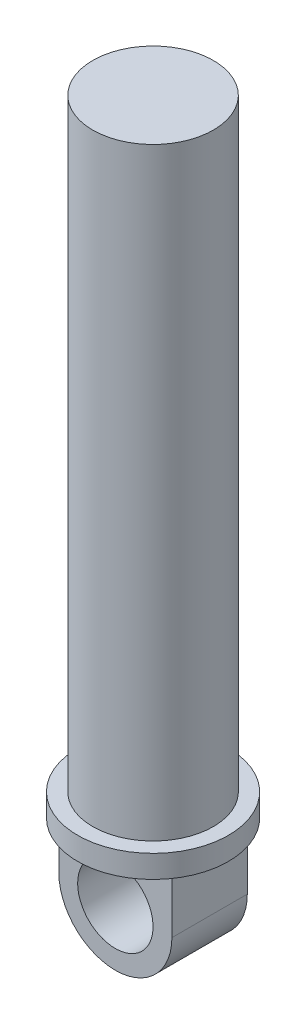
ISO-10303-21;
HEADER;
FILE_DESCRIPTION(('STEP AP214'),'2;1');
FILE_NAME('part.step','',(''),(''),'','','');
FILE_SCHEMA(('AUTOMOTIVE_DESIGN { 1 0 10303 214 1 1 1 1 }'));
ENDSEC;
DATA;
#1=APPLICATION_CONTEXT('core data for automotive mechanical design processes');
#2=APPLICATION_PROTOCOL_DEFINITION('international standard','automotive_design',2000,#1);
#3=PRODUCT_CONTEXT('',#1,'mechanical');
#4=PRODUCT('Part','Part','',(#3));
#5=PRODUCT_RELATED_PRODUCT_CATEGORY('part','',(#4));
#6=PRODUCT_DEFINITION_FORMATION('','',#4);
#7=PRODUCT_DEFINITION_CONTEXT('part definition',#1,'design');
#8=PRODUCT_DEFINITION('design','',#6,#7);
#9=PRODUCT_DEFINITION_SHAPE('','',#8);
#10=(LENGTH_UNIT() NAMED_UNIT(*) SI_UNIT(.MILLI.,.METRE.));
#11=(NAMED_UNIT(*) PLANE_ANGLE_UNIT() SI_UNIT($,.RADIAN.));
#12=(NAMED_UNIT(*) SI_UNIT($,.STERADIAN.) SOLID_ANGLE_UNIT());
#13=UNCERTAINTY_MEASURE_WITH_UNIT(LENGTH_MEASURE(1.E-05),#10,'distance_accuracy_value','');
#14=(GEOMETRIC_REPRESENTATION_CONTEXT(3) GLOBAL_UNCERTAINTY_ASSIGNED_CONTEXT((#13)) GLOBAL_UNIT_ASSIGNED_CONTEXT((#10,
#11,#12)) REPRESENTATION_CONTEXT('',''));
#15=CARTESIAN_POINT('',(0.,0.,0.));
#16=DIRECTION('',(0.,0.,1.));
#17=DIRECTION('',(1.,0.,0.));
#18=AXIS2_PLACEMENT_3D('',#15,#16,#17);
#19=CARTESIAN_POINT('',(0.,80.,0.));
#20=DIRECTION('',(0.,-1.,0.));
#21=DIRECTION('',(0.,0.,-1.));
#22=AXIS2_PLACEMENT_3D('',#19,#20,#21);
#23=CYLINDRICAL_SURFACE('',#22,8.);
#24=CARTESIAN_POINT('',(0.,80.,0.));
#25=DIRECTION('',(0.,1.,0.));
#26=DIRECTION('',(0.,0.,1.));
#27=AXIS2_PLACEMENT_3D('',#24,#25,#26);
#28=CIRCLE('',#27,8.);
#29=CARTESIAN_POINT('',(0.,80.,8.));
#30=VERTEX_POINT('',#29);
#31=EDGE_CURVE('E141',#30,#30,#28,.T.);
#32=ORIENTED_EDGE('',*,*,#31,.F.);
#33=EDGE_LOOP('',(#32));
#34=FACE_BOUND('',#33,.T.);
#35=CARTESIAN_POINT('',(0.,0.,0.));
#36=DIRECTION('',(0.,1.,0.));
#37=DIRECTION('',(0.,0.,1.));
#38=AXIS2_PLACEMENT_3D('',#35,#36,#37);
#39=CIRCLE('',#38,8.);
#40=CARTESIAN_POINT('',(0.,0.,8.));
#41=VERTEX_POINT('',#40);
#42=EDGE_CURVE('E137',#41,#41,#39,.T.);
#43=ORIENTED_EDGE('',*,*,#42,.T.);
#44=EDGE_LOOP('',(#43));
#45=FACE_BOUND('',#44,.T.);
#46=ADVANCED_FACE('F45',(#34,#45),#23,.T.);
#47=CARTESIAN_POINT('',(0.,80.,0.));
#48=DIRECTION('',(0.,1.,0.));
#49=DIRECTION('',(0.,0.,1.));
#50=AXIS2_PLACEMENT_3D('',#47,#48,#49);
#51=PLANE('',#50);
#52=ORIENTED_EDGE('',*,*,#31,.T.);
#53=EDGE_LOOP('',(#52));
#54=FACE_BOUND('',#53,.T.);
#55=ADVANCED_FACE('F193',(#54),#51,.T.);
#56=CARTESIAN_POINT('',(0.,-3.,0.));
#57=DIRECTION('',(0.,1.,0.));
#58=DIRECTION('',(0.,0.,1.));
#59=AXIS2_PLACEMENT_3D('',#56,#57,#58);
#60=CYLINDRICAL_SURFACE('',#59,10.);
#61=CARTESIAN_POINT('',(0.,-3.,0.));
#62=DIRECTION('',(0.,-1.,0.));
#63=DIRECTION('',(0.,0.,-1.));
#64=AXIS2_PLACEMENT_3D('',#61,#62,#63);
#65=CIRCLE('',#64,10.);
#66=CARTESIAN_POINT('',(0.,-3.,-10.));
#67=VERTEX_POINT('',#66);
#68=EDGE_CURVE('E133',#67,#67,#65,.T.);
#69=ORIENTED_EDGE('',*,*,#68,.F.);
#70=EDGE_LOOP('',(#69));
#71=FACE_BOUND('',#70,.T.);
#72=CARTESIAN_POINT('',(0.,0.,0.));
#73=DIRECTION('',(0.,-1.,0.));
#74=DIRECTION('',(0.,0.,-1.));
#75=AXIS2_PLACEMENT_3D('',#72,#73,#74);
#76=CIRCLE('',#75,10.);
#77=CARTESIAN_POINT('',(0.,0.,-10.));
#78=VERTEX_POINT('',#77);
#79=EDGE_CURVE('E132',#78,#78,#76,.T.);
#80=ORIENTED_EDGE('',*,*,#79,.T.);
#81=EDGE_LOOP('',(#80));
#82=FACE_BOUND('',#81,.T.);
#83=ADVANCED_FACE('F199',(#71,#82),#60,.T.);
#84=CARTESIAN_POINT('',(0.,-3.,0.));
#85=DIRECTION('',(0.,-1.,0.));
#86=DIRECTION('',(0.,0.,-1.));
#87=AXIS2_PLACEMENT_3D('',#84,#85,#86);
#88=PLANE('',#87);
#89=DIRECTION('',(0.,0.,1.));
#90=VECTOR('',#89,1.);
#91=CARTESIAN_POINT('',(7.5,-3.,-5.));
#92=LINE('',#91,#90);
#93=CARTESIAN_POINT('',(7.5,-3.,-5.));
#94=VERTEX_POINT('',#93);
#95=CARTESIAN_POINT('',(7.5,-3.,5.));
#96=VERTEX_POINT('',#95);
#97=EDGE_CURVE('E116',#94,#96,#92,.T.);
#98=ORIENTED_EDGE('',*,*,#97,.F.);
#99=DIRECTION('',(1.,0.,0.));
#100=VECTOR('',#99,1.);
#101=CARTESIAN_POINT('',(-7.5,-3.,-5.));
#102=LINE('',#101,#100);
#103=CARTESIAN_POINT('',(-7.5,-3.,-5.));
#104=VERTEX_POINT('',#103);
#105=EDGE_CURVE('E111',#104,#94,#102,.T.);
#106=ORIENTED_EDGE('',*,*,#105,.F.);
#107=DIRECTION('',(0.,0.,-1.));
#108=VECTOR('',#107,1.);
#109=CARTESIAN_POINT('',(-7.5,-3.,-5.));
#110=LINE('',#109,#108);
#111=CARTESIAN_POINT('',(-7.5,-3.,5.));
#112=VERTEX_POINT('',#111);
#113=EDGE_CURVE('E94',#112,#104,#110,.T.);
#114=ORIENTED_EDGE('',*,*,#113,.F.);
#115=DIRECTION('',(-1.,0.,0.));
#116=VECTOR('',#115,1.);
#117=CARTESIAN_POINT('',(-7.5,-3.,5.));
#118=LINE('',#117,#116);
#119=EDGE_CURVE('E108',#96,#112,#118,.T.);
#120=ORIENTED_EDGE('',*,*,#119,.F.);
#121=EDGE_LOOP('',(#98,#106,#114,#120));
#122=FACE_BOUND('',#121,.T.);
#123=ORIENTED_EDGE('',*,*,#68,.T.);
#124=EDGE_LOOP('',(#123));
#125=FACE_BOUND('',#124,.T.);
#126=ADVANCED_FACE('F106',(#122,#125),#88,.T.);
#127=CARTESIAN_POINT('',(0.,0.,0.));
#128=DIRECTION('',(0.,-1.,0.));
#129=DIRECTION('',(0.,0.,-1.));
#130=AXIS2_PLACEMENT_3D('',#127,#128,#129);
#131=PLANE('',#130);
#132=ORIENTED_EDGE('',*,*,#42,.F.);
#133=EDGE_LOOP('',(#132));
#134=FACE_BOUND('',#133,.T.);
#135=ORIENTED_EDGE('',*,*,#79,.F.);
#136=EDGE_LOOP('',(#135));
#137=FACE_BOUND('',#136,.T.);
#138=ADVANCED_FACE('F238',(#134,#137),#131,.F.);
#139=CARTESIAN_POINT('',(7.5,-18.,-5.));
#140=DIRECTION('',(-1.,0.,0.));
#141=DIRECTION('',(0.,0.,1.));
#142=AXIS2_PLACEMENT_3D('',#139,#140,#141);
#143=PLANE('',#142);
#144=DIRECTION('',(0.,1.,0.));
#145=VECTOR('',#144,1.);
#146=CARTESIAN_POINT('',(7.5,-18.,5.));
#147=LINE('',#146,#145);
#148=CARTESIAN_POINT('',(7.5,-10.5,5.));
#149=VERTEX_POINT('',#148);
#150=EDGE_CURVE('E99',#149,#96,#147,.T.);
#151=ORIENTED_EDGE('',*,*,#150,.F.);
#152=DIRECTION('',(0.,0.,1.));
#153=VECTOR('',#152,1.);
#154=CARTESIAN_POINT('',(7.5,-10.5,-5.));
#155=LINE('',#154,#153);
#156=CARTESIAN_POINT('',(7.5,-10.5,-5.));
#157=VERTEX_POINT('',#156);
#158=EDGE_CURVE('E11',#149,#157,#155,.F.);
#159=ORIENTED_EDGE('',*,*,#158,.T.);
#160=DIRECTION('',(0.,1.,0.));
#161=VECTOR('',#160,1.);
#162=CARTESIAN_POINT('',(7.5,-18.,-5.));
#163=LINE('',#162,#161);
#164=EDGE_CURVE('E125',#157,#94,#163,.T.);
#165=ORIENTED_EDGE('',*,*,#164,.T.);
#166=ORIENTED_EDGE('',*,*,#97,.T.);
#167=EDGE_LOOP('',(#151,#159,#165,#166));
#168=FACE_BOUND('',#167,.T.);
#169=ADVANCED_FACE('F231',(#168),#143,.F.);
#170=CARTESIAN_POINT('',(-7.5,-18.,5.));
#171=DIRECTION('',(0.,0.,-1.));
#172=DIRECTION('',(-1.,0.,0.));
#173=AXIS2_PLACEMENT_3D('',#170,#171,#172);
#174=PLANE('',#173);
#175=CARTESIAN_POINT('',(0.,-10.5,5.));
#176=DIRECTION('',(0.,0.,-1.));
#177=DIRECTION('',(-1.,0.,0.));
#178=AXIS2_PLACEMENT_3D('',#175,#176,#177);
#179=CIRCLE('',#178,5.);
#180=CARTESIAN_POINT('',(-5.,-10.5,5.));
#181=VERTEX_POINT('',#180);
#182=EDGE_CURVE('E119',#181,#181,#179,.T.);
#183=ORIENTED_EDGE('',*,*,#182,.T.);
#184=EDGE_LOOP('',(#183));
#185=FACE_BOUND('',#184,.T.);
#186=DIRECTION('',(0.,1.,0.));
#187=VECTOR('',#186,1.);
#188=CARTESIAN_POINT('',(-7.5,-18.,5.));
#189=LINE('',#188,#187);
#190=CARTESIAN_POINT('',(-7.5,-10.5,5.));
#191=VERTEX_POINT('',#190);
#192=EDGE_CURVE('E90',#191,#112,#189,.T.);
#193=ORIENTED_EDGE('',*,*,#192,.F.);
#194=CARTESIAN_POINT('',(0.,-10.5,5.));
#195=DIRECTION('',(0.,0.,-1.));
#196=DIRECTION('',(-1.,0.,0.));
#197=AXIS2_PLACEMENT_3D('',#194,#195,#196);
#198=CIRCLE('',#197,7.5);
#199=CARTESIAN_POINT('',(0.,-18.,5.));
#200=VERTEX_POINT('',#199);
#201=EDGE_CURVE('E55',#191,#200,#198,.F.);
#202=ORIENTED_EDGE('',*,*,#201,.T.);
#203=CARTESIAN_POINT('',(0.,-10.5,5.));
#204=DIRECTION('',(0.,0.,-1.));
#205=DIRECTION('',(-1.,0.,0.));
#206=AXIS2_PLACEMENT_3D('',#203,#204,#205);
#207=CIRCLE('',#206,7.5);
#208=EDGE_CURVE('E62',#200,#149,#207,.F.);
#209=ORIENTED_EDGE('',*,*,#208,.T.);
#210=ORIENTED_EDGE('',*,*,#150,.T.);
#211=ORIENTED_EDGE('',*,*,#119,.T.);
#212=EDGE_LOOP('',(#193,#202,#209,#210,#211));
#213=FACE_BOUND('',#212,.T.);
#214=ADVANCED_FACE('F114',(#185,#213),#174,.F.);
#215=CARTESIAN_POINT('',(-7.5,-18.,-5.));
#216=DIRECTION('',(1.,0.,0.));
#217=DIRECTION('',(0.,0.,-1.));
#218=AXIS2_PLACEMENT_3D('',#215,#216,#217);
#219=PLANE('',#218);
#220=DIRECTION('',(0.,1.,0.));
#221=VECTOR('',#220,1.);
#222=CARTESIAN_POINT('',(-7.5,-18.,-5.));
#223=LINE('',#222,#221);
#224=CARTESIAN_POINT('',(-7.5,-10.5,-5.));
#225=VERTEX_POINT('',#224);
#226=EDGE_CURVE('E100',#225,#104,#223,.T.);
#227=ORIENTED_EDGE('',*,*,#226,.F.);
#228=DIRECTION('',(0.,0.,-1.));
#229=VECTOR('',#228,1.);
#230=CARTESIAN_POINT('',(-7.5,-10.5,-5.));
#231=LINE('',#230,#229);
#232=EDGE_CURVE('E96',#225,#191,#231,.F.);
#233=ORIENTED_EDGE('',*,*,#232,.T.);
#234=ORIENTED_EDGE('',*,*,#192,.T.);
#235=ORIENTED_EDGE('',*,*,#113,.T.);
#236=EDGE_LOOP('',(#227,#233,#234,#235));
#237=FACE_BOUND('',#236,.T.);
#238=ADVANCED_FACE('F93',(#237),#219,.F.);
#239=CARTESIAN_POINT('',(-7.5,-18.,-5.));
#240=DIRECTION('',(0.,0.,1.));
#241=DIRECTION('',(1.,0.,0.));
#242=AXIS2_PLACEMENT_3D('',#239,#240,#241);
#243=PLANE('',#242);
#244=CARTESIAN_POINT('',(0.,-10.5,-5.));
#245=DIRECTION('',(0.,0.,-1.));
#246=DIRECTION('',(-1.,0.,0.));
#247=AXIS2_PLACEMENT_3D('',#244,#245,#246);
#248=CIRCLE('',#247,5.);
#249=CARTESIAN_POINT('',(-5.,-10.5,-5.));
#250=VERTEX_POINT('',#249);
#251=EDGE_CURVE('E170',#250,#250,#248,.T.);
#252=ORIENTED_EDGE('',*,*,#251,.F.);
#253=EDGE_LOOP('',(#252));
#254=FACE_BOUND('',#253,.T.);
#255=CARTESIAN_POINT('',(0.,-10.5,-5.));
#256=DIRECTION('',(0.,0.,1.));
#257=DIRECTION('',(1.,0.,0.));
#258=AXIS2_PLACEMENT_3D('',#255,#256,#257);
#259=CIRCLE('',#258,7.5);
#260=CARTESIAN_POINT('',(0.,-18.,-5.));
#261=VERTEX_POINT('',#260);
#262=EDGE_CURVE('E145',#157,#261,#259,.F.);
#263=ORIENTED_EDGE('',*,*,#262,.T.);
#264=CARTESIAN_POINT('',(0.,-10.5,-5.));
#265=DIRECTION('',(0.,0.,1.));
#266=DIRECTION('',(1.,0.,0.));
#267=AXIS2_PLACEMENT_3D('',#264,#265,#266);
#268=CIRCLE('',#267,7.5);
#269=EDGE_CURVE('E151',#261,#225,#268,.F.);
#270=ORIENTED_EDGE('',*,*,#269,.T.);
#271=ORIENTED_EDGE('',*,*,#226,.T.);
#272=ORIENTED_EDGE('',*,*,#105,.T.);
#273=ORIENTED_EDGE('',*,*,#164,.F.);
#274=EDGE_LOOP('',(#263,#270,#271,#272,#273));
#275=FACE_BOUND('',#274,.T.);
#276=ADVANCED_FACE('F161',(#254,#275),#243,.F.);
#277=CARTESIAN_POINT('',(0.,-10.5,10.));
#278=DIRECTION('',(0.,0.,-1.));
#279=DIRECTION('',(-1.,0.,0.));
#280=AXIS2_PLACEMENT_3D('',#277,#278,#279);
#281=CYLINDRICAL_SURFACE('',#280,5.);
#282=ORIENTED_EDGE('',*,*,#251,.T.);
#283=EDGE_LOOP('',(#282));
#284=FACE_BOUND('',#283,.T.);
#285=ORIENTED_EDGE('',*,*,#182,.F.);
#286=EDGE_LOOP('',(#285));
#287=FACE_BOUND('',#286,.T.);
#288=ADVANCED_FACE('F181',(#284,#287),#281,.F.);
#289=CARTESIAN_POINT('',(0.,-10.5,0.));
#290=DIRECTION('',(0.,0.,1.));
#291=DIRECTION('',(1.,0.,0.));
#292=AXIS2_PLACEMENT_3D('',#289,#290,#291);
#293=CYLINDRICAL_SURFACE('',#292,7.5);
#294=ORIENTED_EDGE('',*,*,#158,.F.);
#295=ORIENTED_EDGE('',*,*,#208,.F.);
#296=DIRECTION('',(0.,0.,1.));
#297=VECTOR('',#296,1.);
#298=CARTESIAN_POINT('',(0.,-18.,0.));
#299=LINE('',#298,#297);
#300=EDGE_CURVE('E49',#261,#200,#299,.T.);
#301=ORIENTED_EDGE('',*,*,#300,.F.);
#302=ORIENTED_EDGE('',*,*,#262,.F.);
#303=EDGE_LOOP('',(#294,#295,#301,#302));
#304=FACE_BOUND('',#303,.T.);
#305=ADVANCED_FACE('F47',(#304),#293,.T.);
#306=CARTESIAN_POINT('',(0.,-10.5,0.));
#307=DIRECTION('',(0.,0.,-1.));
#308=DIRECTION('',(-1.,0.,0.));
#309=AXIS2_PLACEMENT_3D('',#306,#307,#308);
#310=CYLINDRICAL_SURFACE('',#309,7.5);
#311=ORIENTED_EDGE('',*,*,#201,.F.);
#312=ORIENTED_EDGE('',*,*,#232,.F.);
#313=ORIENTED_EDGE('',*,*,#269,.F.);
#314=ORIENTED_EDGE('',*,*,#300,.T.);
#315=EDGE_LOOP('',(#311,#312,#313,#314));
#316=FACE_BOUND('',#315,.T.);
#317=ADVANCED_FACE('F167',(#316),#310,.T.);
#318=CLOSED_SHELL('',(#46,#55,#83,#126,#138,#169,#214,#238,#276,#288,#305,#317));
#319=MANIFOLD_SOLID_BREP('B2',#318);
#320=ADVANCED_BREP_SHAPE_REPRESENTATION('',(#18,#319),#14);
#321=SHAPE_DEFINITION_REPRESENTATION(#9,#320);
ENDSEC;
END-ISO-10303-21;
